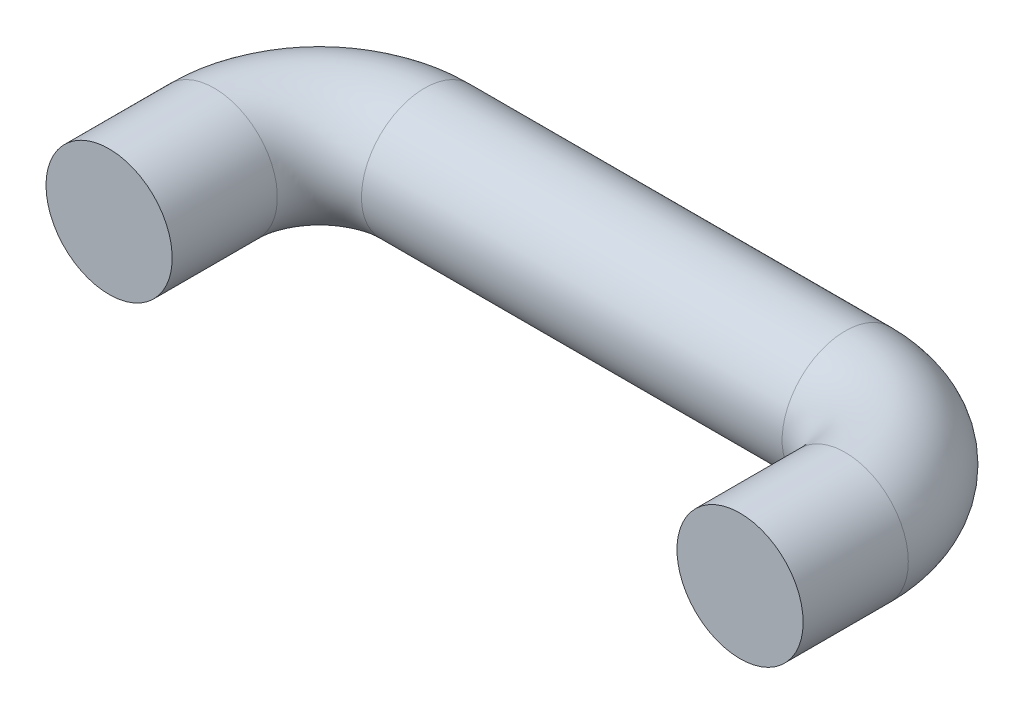
ISO-10303-21;
HEADER;
FILE_DESCRIPTION(('STEP AP214'),'2;1');
FILE_NAME('part.step','',(''),(''),'','','');
FILE_SCHEMA(('AUTOMOTIVE_DESIGN { 1 0 10303 214 1 1 1 1 }'));
ENDSEC;
DATA;
#1=APPLICATION_CONTEXT('core data for automotive mechanical design processes');
#2=APPLICATION_PROTOCOL_DEFINITION('international standard','automotive_design',2000,#1);
#3=PRODUCT_CONTEXT('',#1,'mechanical');
#4=PRODUCT('Part','Part','',(#3));
#5=PRODUCT_RELATED_PRODUCT_CATEGORY('part','',(#4));
#6=PRODUCT_DEFINITION_FORMATION('','',#4);
#7=PRODUCT_DEFINITION_CONTEXT('part definition',#1,'design');
#8=PRODUCT_DEFINITION('design','',#6,#7);
#9=PRODUCT_DEFINITION_SHAPE('','',#8);
#10=(LENGTH_UNIT() NAMED_UNIT(*) SI_UNIT(.MILLI.,.METRE.));
#11=(NAMED_UNIT(*) PLANE_ANGLE_UNIT() SI_UNIT($,.RADIAN.));
#12=(NAMED_UNIT(*) SI_UNIT($,.STERADIAN.) SOLID_ANGLE_UNIT());
#13=UNCERTAINTY_MEASURE_WITH_UNIT(LENGTH_MEASURE(1.E-05),#10,'distance_accuracy_value','');
#14=(GEOMETRIC_REPRESENTATION_CONTEXT(3) GLOBAL_UNCERTAINTY_ASSIGNED_CONTEXT((#13)) GLOBAL_UNIT_ASSIGNED_CONTEXT((#10,
#11,#12)) REPRESENTATION_CONTEXT('',''));
#15=CARTESIAN_POINT('',(0.,0.,0.));
#16=DIRECTION('',(0.,0.,1.));
#17=DIRECTION('',(1.,0.,0.));
#18=AXIS2_PLACEMENT_3D('',#15,#16,#17);
#19=CARTESIAN_POINT('',(-30.,0.,20.));
#20=DIRECTION('',(0.,0.,1.));
#21=DIRECTION('',(1.,0.,0.));
#22=AXIS2_PLACEMENT_3D('',#19,#20,#21);
#23=CYLINDRICAL_SURFACE('',#22,3.);
#24=CARTESIAN_POINT('',(-30.,0.,20.));
#25=DIRECTION('',(0.,0.,1.));
#26=DIRECTION('',(1.,0.,0.));
#27=AXIS2_PLACEMENT_3D('',#24,#25,#26);
#28=CIRCLE('',#27,3.);
#29=CARTESIAN_POINT('',(-27.,0.,20.0000000000001));
#30=VERTEX_POINT('',#29);
#31=EDGE_CURVE('E37',#30,#30,#28,.T.);
#32=ORIENTED_EDGE('',*,*,#31,.T.);
#33=EDGE_LOOP('',(#32));
#34=FACE_BOUND('',#33,.T.);
#35=CARTESIAN_POINT('',(-30.,0.,25.));
#36=DIRECTION('',(0.,0.,1.));
#37=DIRECTION('',(1.,0.,0.));
#38=AXIS2_PLACEMENT_3D('',#35,#36,#37);
#39=CIRCLE('',#38,3.);
#40=CARTESIAN_POINT('',(-27.,0.,25.0000000000001));
#41=VERTEX_POINT('',#40);
#42=EDGE_CURVE('E10',#41,#41,#39,.T.);
#43=ORIENTED_EDGE('',*,*,#42,.F.);
#44=EDGE_LOOP('',(#43));
#45=FACE_BOUND('',#44,.T.);
#46=ADVANCED_FACE('F31',(#34,#45),#23,.T.);
#47=CARTESIAN_POINT('',(-35.,0.,20.));
#48=DIRECTION('',(0.,-1.,0.));
#49=DIRECTION('',(0.,0.,-1.));
#50=AXIS2_PLACEMENT_3D('',#47,#48,#49);
#51=TOROIDAL_SURFACE('',#50,4.99999999999999,3.);
#52=CARTESIAN_POINT('',(-35.,0.,15.));
#53=DIRECTION('',(1.,0.,0.));
#54=DIRECTION('',(0.,0.,-1.));
#55=AXIS2_PLACEMENT_3D('',#52,#53,#54);
#56=CIRCLE('',#55,3.);
#57=CARTESIAN_POINT('',(-35.,0.,12.));
#58=VERTEX_POINT('',#57);
#59=EDGE_CURVE('E41',#58,#58,#56,.T.);
#60=CARTESIAN_POINT('',(-35.,0.,20.));
#61=DIRECTION('',(0.,-1.,0.));
#62=DIRECTION('',(0.,0.,-1.));
#63=AXIS2_PLACEMENT_3D('',#60,#61,#62);
#64=CIRCLE('',#63,7.99999999999999);
#65=EDGE_CURVE('',#58,#30,#64,.T.);
#66=ORIENTED_EDGE('',*,*,#59,.T.);
#67=ORIENTED_EDGE('',*,*,#31,.F.);
#68=ORIENTED_EDGE('',*,*,#65,.T.);
#69=ORIENTED_EDGE('',*,*,#65,.F.);
#70=EDGE_LOOP('',(#66,#68,#67,#69));
#71=FACE_BOUND('',#70,.T.);
#72=ADVANCED_FACE('F75',(#71),#51,.T.);
#73=CARTESIAN_POINT('',(-54.9999999999999,0.,15.));
#74=DIRECTION('',(1.,0.,0.));
#75=DIRECTION('',(0.,0.,-1.));
#76=AXIS2_PLACEMENT_3D('',#73,#74,#75);
#77=CYLINDRICAL_SURFACE('',#76,3.);
#78=CARTESIAN_POINT('',(-54.9999999999999,0.,15.));
#79=DIRECTION('',(1.,0.,0.));
#80=DIRECTION('',(0.,0.,-1.));
#81=AXIS2_PLACEMENT_3D('',#78,#79,#80);
#82=CIRCLE('',#81,3.);
#83=CARTESIAN_POINT('',(-54.9999999999999,0.,12.));
#84=VERTEX_POINT('',#83);
#85=EDGE_CURVE('E45',#84,#84,#82,.T.);
#86=ORIENTED_EDGE('',*,*,#85,.T.);
#87=EDGE_LOOP('',(#86));
#88=FACE_BOUND('',#87,.T.);
#89=ORIENTED_EDGE('',*,*,#59,.F.);
#90=EDGE_LOOP('',(#89));
#91=FACE_BOUND('',#90,.T.);
#92=ADVANCED_FACE('F79',(#88,#91),#77,.T.);
#93=CARTESIAN_POINT('',(-55.,0.,20.));
#94=DIRECTION('',(0.,-1.,0.));
#95=DIRECTION('',(0.,0.,-1.));
#96=AXIS2_PLACEMENT_3D('',#93,#94,#95);
#97=TOROIDAL_SURFACE('',#96,5.,3.);
#98=CARTESIAN_POINT('',(-60.,0.,20.));
#99=DIRECTION('',(0.,0.,-1.));
#100=DIRECTION('',(-1.,0.,0.));
#101=AXIS2_PLACEMENT_3D('',#98,#99,#100);
#102=CIRCLE('',#101,3.);
#103=CARTESIAN_POINT('',(-63.,0.,20.0000000000001));
#104=VERTEX_POINT('',#103);
#105=EDGE_CURVE('E50',#104,#104,#102,.T.);
#106=CARTESIAN_POINT('',(-55.,0.,20.));
#107=DIRECTION('',(0.,-1.,0.));
#108=DIRECTION('',(0.,0.,-1.));
#109=AXIS2_PLACEMENT_3D('',#106,#107,#108);
#110=CIRCLE('',#109,8.);
#111=EDGE_CURVE('',#104,#84,#110,.T.);
#112=ORIENTED_EDGE('',*,*,#105,.T.);
#113=ORIENTED_EDGE('',*,*,#85,.F.);
#114=ORIENTED_EDGE('',*,*,#111,.T.);
#115=ORIENTED_EDGE('',*,*,#111,.F.);
#116=EDGE_LOOP('',(#112,#114,#113,#115));
#117=FACE_BOUND('',#116,.T.);
#118=ADVANCED_FACE('F57',(#117),#97,.T.);
#119=CARTESIAN_POINT('',(-60.,0.,20.));
#120=DIRECTION('',(0.,0.,1.));
#121=DIRECTION('',(1.,0.,0.));
#122=AXIS2_PLACEMENT_3D('',#119,#120,#121);
#123=CYLINDRICAL_SURFACE('',#122,3.);
#124=ORIENTED_EDGE('',*,*,#105,.F.);
#125=EDGE_LOOP('',(#124));
#126=FACE_BOUND('',#125,.T.);
#127=CARTESIAN_POINT('',(-60.,0.,25.));
#128=DIRECTION('',(0.,0.,-1.));
#129=DIRECTION('',(-1.,0.,0.));
#130=AXIS2_PLACEMENT_3D('',#127,#128,#129);
#131=CIRCLE('',#130,3.);
#132=CARTESIAN_POINT('',(-63.,0.,25.));
#133=VERTEX_POINT('',#132);
#134=EDGE_CURVE('E51',#133,#133,#131,.T.);
#135=ORIENTED_EDGE('',*,*,#134,.T.);
#136=EDGE_LOOP('',(#135));
#137=FACE_BOUND('',#136,.T.);
#138=ADVANCED_FACE('F60',(#126,#137),#123,.T.);
#139=CARTESIAN_POINT('',(-30.,0.,25.));
#140=DIRECTION('',(0.,0.,1.));
#141=DIRECTION('',(1.,0.,0.));
#142=AXIS2_PLACEMENT_3D('',#139,#140,#141);
#143=PLANE('',#142);
#144=ORIENTED_EDGE('',*,*,#42,.T.);
#145=EDGE_LOOP('',(#144));
#146=FACE_BOUND('',#145,.T.);
#147=ADVANCED_FACE('F63',(#146),#143,.T.);
#148=CARTESIAN_POINT('',(-60.,0.,25.));
#149=DIRECTION('',(0.,0.,-1.));
#150=DIRECTION('',(-1.,0.,0.));
#151=AXIS2_PLACEMENT_3D('',#148,#149,#150);
#152=PLANE('',#151);
#153=ORIENTED_EDGE('',*,*,#134,.F.);
#154=EDGE_LOOP('',(#153));
#155=FACE_BOUND('',#154,.T.);
#156=ADVANCED_FACE('F67',(#155),#152,.F.);
#157=CLOSED_SHELL('',(#46,#72,#92,#118,#138,#147,#156));
#158=MANIFOLD_SOLID_BREP('B2',#157);
#159=ADVANCED_BREP_SHAPE_REPRESENTATION('',(#18,#158),#14);
#160=SHAPE_DEFINITION_REPRESENTATION(#9,#159);
ENDSEC;
END-ISO-10303-21;
